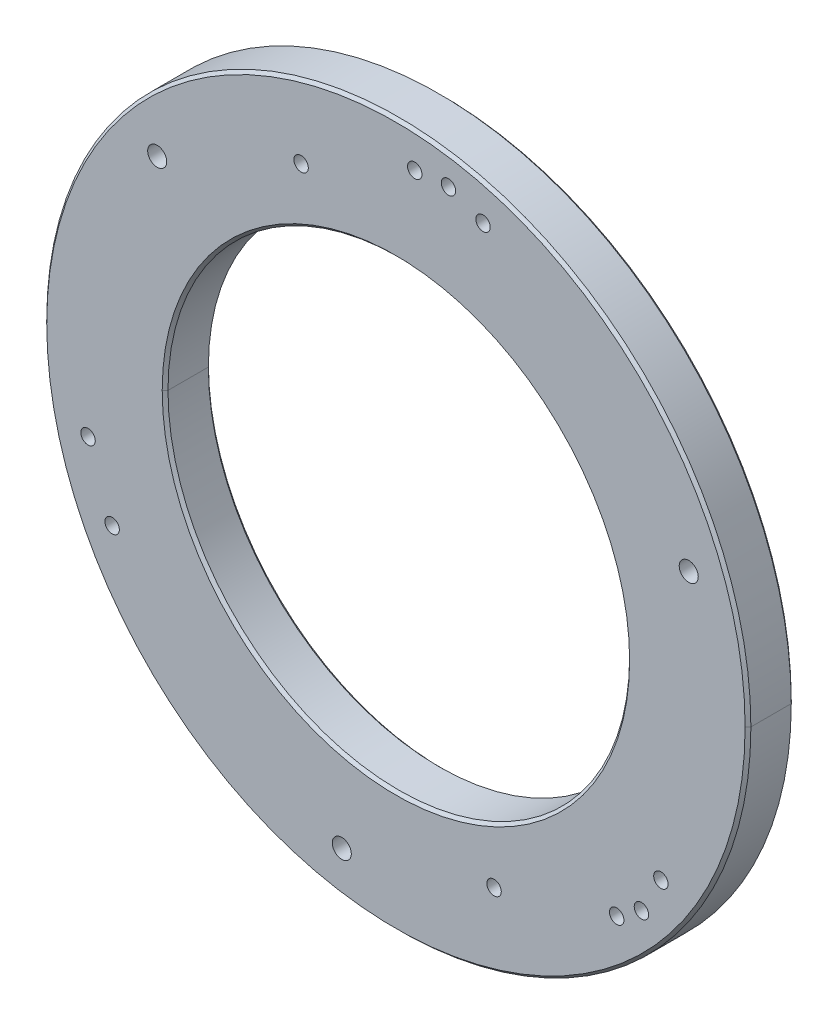
ISO-10303-21;
HEADER;
FILE_DESCRIPTION(('STEP AP214'),'2;1');
FILE_NAME('part.step','',(''),(''),'','','');
FILE_SCHEMA(('AUTOMOTIVE_DESIGN { 1 0 10303 214 1 1 1 1 }'));
ENDSEC;
DATA;
#1=APPLICATION_CONTEXT('core data for automotive mechanical design processes');
#2=APPLICATION_PROTOCOL_DEFINITION('international standard','automotive_design',2000,#1);
#3=PRODUCT_CONTEXT('',#1,'mechanical');
#4=PRODUCT('Part','Part','',(#3));
#5=PRODUCT_RELATED_PRODUCT_CATEGORY('part','',(#4));
#6=PRODUCT_DEFINITION_FORMATION('','',#4);
#7=PRODUCT_DEFINITION_CONTEXT('part definition',#1,'design');
#8=PRODUCT_DEFINITION('design','',#6,#7);
#9=PRODUCT_DEFINITION_SHAPE('','',#8);
#10=(LENGTH_UNIT() NAMED_UNIT(*) SI_UNIT(.MILLI.,.METRE.));
#11=(NAMED_UNIT(*) PLANE_ANGLE_UNIT() SI_UNIT($,.RADIAN.));
#12=(NAMED_UNIT(*) SI_UNIT($,.STERADIAN.) SOLID_ANGLE_UNIT());
#13=UNCERTAINTY_MEASURE_WITH_UNIT(LENGTH_MEASURE(1.E-05),#10,'distance_accuracy_value','');
#14=(GEOMETRIC_REPRESENTATION_CONTEXT(3) GLOBAL_UNCERTAINTY_ASSIGNED_CONTEXT((#13)) GLOBAL_UNIT_ASSIGNED_CONTEXT((#10,
#11,#12)) REPRESENTATION_CONTEXT('',''));
#15=CARTESIAN_POINT('',(0.,0.,0.));
#16=DIRECTION('',(0.,0.,1.));
#17=DIRECTION('',(1.,0.,0.));
#18=AXIS2_PLACEMENT_3D('',#15,#16,#17);
#19=CARTESIAN_POINT('',(-82.5144971077506,-16.0135159189414,0.));
#20=DIRECTION('',(0.,0.,1.));
#21=DIRECTION('',(1.,0.,0.));
#22=AXIS2_PLACEMENT_3D('',#19,#20,#21);
#23=PLANE('',#22);
#24=CARTESIAN_POINT('',(-82.5144971077506,-16.0135159189414,0.));
#25=DIRECTION('',(0.,0.,1.));
#26=DIRECTION('',(1.,0.,0.));
#27=AXIS2_PLACEMENT_3D('',#24,#25,#26);
#28=CIRCLE('',#27,40.5);
#29=CARTESIAN_POINT('',(-123.014497107751,-16.0135159189414,0.));
#30=VERTEX_POINT('',#29);
#31=CARTESIAN_POINT('',(-42.0144971077506,-16.0135159189414,0.));
#32=VERTEX_POINT('',#31);
#33=EDGE_CURVE('E212',#30,#32,#28,.T.);
#34=ORIENTED_EDGE('',*,*,#33,.T.);
#35=CARTESIAN_POINT('',(-82.5144971077506,-16.0135159189414,0.));
#36=DIRECTION('',(0.,0.,1.));
#37=DIRECTION('',(1.,0.,0.));
#38=AXIS2_PLACEMENT_3D('',#35,#36,#37);
#39=CIRCLE('',#38,40.5);
#40=EDGE_CURVE('E214',#32,#30,#39,.T.);
#41=ORIENTED_EDGE('',*,*,#40,.T.);
#42=EDGE_LOOP('',(#34,#41));
#43=FACE_BOUND('',#42,.T.);
#44=CARTESIAN_POINT('',(-82.5144971077506,-16.0135159189414,0.));
#45=DIRECTION('',(0.,0.,1.));
#46=DIRECTION('',(1.,0.,0.));
#47=AXIS2_PLACEMENT_3D('',#44,#45,#46);
#48=CIRCLE('',#47,60.5115996052059);
#49=CARTESIAN_POINT('',(-143.026096712956,-16.0135159189414,0.));
#50=VERTEX_POINT('',#49);
#51=CARTESIAN_POINT('',(-22.0028975025447,-16.0135159189414,0.));
#52=VERTEX_POINT('',#51);
#53=EDGE_CURVE('E196',#50,#52,#48,.F.);
#54=ORIENTED_EDGE('',*,*,#53,.T.);
#55=CARTESIAN_POINT('',(-82.5144971077506,-16.0135159189414,0.));
#56=DIRECTION('',(0.,0.,1.));
#57=DIRECTION('',(1.,0.,0.));
#58=AXIS2_PLACEMENT_3D('',#55,#56,#57);
#59=CIRCLE('',#58,60.5115996052059);
#60=EDGE_CURVE('E209',#52,#50,#59,.F.);
#61=ORIENTED_EDGE('',*,*,#60,.T.);
#62=EDGE_LOOP('',(#54,#61));
#63=FACE_BOUND('',#62,.T.);
#64=CARTESIAN_POINT('',(-91.8951761523299,-69.183415120825,0.));
#65=DIRECTION('',(0.,0.,1.));
#66=DIRECTION('',(1.,0.,0.));
#67=AXIS2_PLACEMENT_3D('',#64,#65,#66);
#68=CIRCLE('',#67,1.65);
#69=CARTESIAN_POINT('',(-90.2451761523299,-69.183415120825,0.));
#70=VERTEX_POINT('',#69);
#71=EDGE_CURVE('E381',#70,#70,#68,.T.);
#72=ORIENTED_EDGE('',*,*,#71,.T.);
#73=EDGE_LOOP('',(#72));
#74=FACE_BOUND('',#73,.T.);
#75=CARTESIAN_POINT('',(-31.7708338197858,2.44344707650623,0.));
#76=DIRECTION('',(0.,0.,1.));
#77=DIRECTION('',(1.,0.,0.));
#78=AXIS2_PLACEMENT_3D('',#75,#76,#77);
#79=CIRCLE('',#78,1.65);
#80=CARTESIAN_POINT('',(-30.1208338197859,2.44344707650623,0.));
#81=VERTEX_POINT('',#80);
#82=EDGE_CURVE('E377',#81,#81,#79,.T.);
#83=ORIENTED_EDGE('',*,*,#82,.T.);
#84=EDGE_LOOP('',(#83));
#85=FACE_BOUND('',#84,.T.);
#86=CARTESIAN_POINT('',(-123.882402822117,18.6871929611194,0.));
#87=DIRECTION('',(0.,0.,1.));
#88=DIRECTION('',(1.,0.,0.));
#89=AXIS2_PLACEMENT_3D('',#86,#87,#88);
#90=CIRCLE('',#89,1.65);
#91=CARTESIAN_POINT('',(-122.232402822117,18.6871929611194,0.));
#92=VERTEX_POINT('',#91);
#93=EDGE_CURVE('E373',#92,#92,#90,.T.);
#94=ORIENTED_EDGE('',*,*,#93,.T.);
#95=EDGE_LOOP('',(#94));
#96=FACE_BOUND('',#95,.T.);
#97=CARTESIAN_POINT('',(-73.4081664605467,39.3227641236998,0.));
#98=DIRECTION('',(0.,0.,1.));
#99=DIRECTION('',(1.,0.,0.));
#100=AXIS2_PLACEMENT_3D('',#97,#98,#99);
#101=CIRCLE('',#100,1.25);
#102=CARTESIAN_POINT('',(-72.1581664605467,39.3227641236998,0.));
#103=VERTEX_POINT('',#102);
#104=EDGE_CURVE('E369',#103,#103,#101,.T.);
#105=ORIENTED_EDGE('',*,*,#104,.T.);
#106=EDGE_LOOP('',(#105));
#107=FACE_BOUND('',#106,.T.);
#108=CARTESIAN_POINT('',(-98.9450242431344,30.0303199031574,0.));
#109=DIRECTION('',(0.,0.,1.));
#110=DIRECTION('',(1.,0.,0.));
#111=AXIS2_PLACEMENT_3D('',#108,#109,#110);
#112=CIRCLE('',#111,1.25);
#113=CARTESIAN_POINT('',(-97.6950242431344,30.0303199031574,0.));
#114=VERTEX_POINT('',#113);
#115=EDGE_CURVE('E365',#114,#114,#112,.T.);
#116=ORIENTED_EDGE('',*,*,#115,.T.);
#117=EDGE_LOOP('',(#116));
#118=FACE_BOUND('',#117,.T.);
#119=CARTESIAN_POINT('',(-39.9697288865487,-52.5704562748082,0.));
#120=DIRECTION('',(0.,0.,1.));
#121=DIRECTION('',(1.,0.,0.));
#122=AXIS2_PLACEMENT_3D('',#119,#120,#121);
#123=CIRCLE('',#122,1.25);
#124=CARTESIAN_POINT('',(-38.7197288865487,-52.5704562748082,0.));
#125=VERTEX_POINT('',#124);
#126=EDGE_CURVE('E361',#125,#125,#123,.T.);
#127=ORIENTED_EDGE('',*,*,#126,.T.);
#128=EDGE_LOOP('',(#127));
#129=FACE_BOUND('',#128,.T.);
#130=CARTESIAN_POINT('',(-65.5065866691364,-61.8629004953506,0.));
#131=DIRECTION('',(0.,0.,1.));
#132=DIRECTION('',(1.,0.,0.));
#133=AXIS2_PLACEMENT_3D('',#130,#131,#132);
#134=CIRCLE('',#133,1.25);
#135=CARTESIAN_POINT('',(-64.2565866691364,-61.8629004953506,0.));
#136=VERTEX_POINT('',#135);
#137=EDGE_CURVE('E357',#136,#136,#134,.T.);
#138=ORIENTED_EDGE('',*,*,#137,.T.);
#139=EDGE_LOOP('',(#138));
#140=FACE_BOUND('',#139,.T.);
#141=CARTESIAN_POINT('',(-36.5984199134899,-46.2908565032668,0.));
#142=DIRECTION('',(0.,0.,-1.));
#143=DIRECTION('',(-1.,0.,0.));
#144=AXIS2_PLACEMENT_3D('',#141,#142,#143);
#145=CIRCLE('',#144,1.25);
#146=CARTESIAN_POINT('',(-37.8484199134899,-46.2908565032668,0.));
#147=VERTEX_POINT('',#146);
#148=EDGE_CURVE('E352',#147,#147,#145,.T.);
#149=ORIENTED_EDGE('',*,*,#148,.F.);
#150=EDGE_LOOP('',(#149));
#151=FACE_BOUND('',#150,.T.);
#152=CARTESIAN_POINT('',(-131.69348180994,-40.6393349191355,0.));
#153=DIRECTION('',(0.,0.,-1.));
#154=DIRECTION('',(-1.,0.,0.));
#155=AXIS2_PLACEMENT_3D('',#152,#153,#154);
#156=CIRCLE('',#155,1.25);
#157=CARTESIAN_POINT('',(-132.94348180994,-40.6393349191355,0.));
#158=VERTEX_POINT('',#157);
#159=EDGE_CURVE('E318',#158,#158,#156,.T.);
#160=ORIENTED_EDGE('',*,*,#159,.F.);
#161=EDGE_LOOP('',(#160));
#162=FACE_BOUND('',#161,.T.);
#163=CARTESIAN_POINT('',(-79.251589599821,38.8896436655783,0.));
#164=DIRECTION('',(0.,0.,-1.));
#165=DIRECTION('',(-1.,0.,0.));
#166=AXIS2_PLACEMENT_3D('',#163,#164,#165);
#167=CIRCLE('',#166,1.25);
#168=CARTESIAN_POINT('',(-80.501589599821,38.8896436655783,0.));
#169=VERTEX_POINT('',#168);
#170=EDGE_CURVE('E327',#169,#169,#167,.T.);
#171=ORIENTED_EDGE('',*,*,#170,.F.);
#172=EDGE_LOOP('',(#171));
#173=FACE_BOUND('',#172,.T.);
#174=CARTESIAN_POINT('',(-67.4218802964211,36.875201361353,0.));
#175=DIRECTION('',(0.,0.,-1.));
#176=DIRECTION('',(-1.,0.,0.));
#177=AXIS2_PLACEMENT_3D('',#174,#175,#176);
#178=CIRCLE('',#177,1.25);
#179=CARTESIAN_POINT('',(-68.6718802964211,36.875201361353,0.));
#180=VERTEX_POINT('',#179);
#181=EDGE_CURVE('E330',#180,#180,#178,.T.);
#182=ORIENTED_EDGE('',*,*,#181,.F.);
#183=EDGE_LOOP('',(#182));
#184=FACE_BOUND('',#183,.T.);
#185=CARTESIAN_POINT('',(-132.330492623555,-34.1407410308416,0.));
#186=DIRECTION('',(0.,0.,1.));
#187=DIRECTION('',(1.,0.,0.));
#188=AXIS2_PLACEMENT_3D('',#185,#186,#187);
#189=CIRCLE('',#188,1.725);
#190=CARTESIAN_POINT('',(-134.055492623555,-34.1407410308416,0.));
#191=VERTEX_POINT('',#190);
#192=CARTESIAN_POINT('',(-130.605492623555,-34.1407410308416,0.));
#193=VERTEX_POINT('',#192);
#194=EDGE_CURVE('E177',#191,#193,#189,.T.);
#195=ORIENTED_EDGE('',*,*,#194,.T.);
#196=CARTESIAN_POINT('',(-132.330492623555,-34.1407410308416,0.));
#197=DIRECTION('',(0.,0.,1.));
#198=DIRECTION('',(1.,0.,0.));
#199=AXIS2_PLACEMENT_3D('',#196,#197,#198);
#200=CIRCLE('',#199,1.725);
#201=EDGE_CURVE('E170',#193,#191,#200,.T.);
#202=ORIENTED_EDGE('',*,*,#201,.T.);
#203=EDGE_LOOP('',(#195,#202));
#204=FACE_BOUND('',#203,.T.);
#205=CARTESIAN_POINT('',(-55.4662346629097,29.5783824644684,0.));
#206=DIRECTION('',(0.,0.,1.));
#207=DIRECTION('',(1.,0.,0.));
#208=AXIS2_PLACEMENT_3D('',#205,#206,#207);
#209=CIRCLE('',#208,1.725);
#210=CARTESIAN_POINT('',(-57.1912346629097,29.5783824644684,0.));
#211=VERTEX_POINT('',#210);
#212=CARTESIAN_POINT('',(-53.7412346629097,29.5783824644684,0.));
#213=VERTEX_POINT('',#212);
#214=EDGE_CURVE('E159',#211,#213,#209,.T.);
#215=ORIENTED_EDGE('',*,*,#214,.T.);
#216=CARTESIAN_POINT('',(-55.4662346629097,29.5783824644684,0.));
#217=DIRECTION('',(0.,0.,1.));
#218=DIRECTION('',(1.,0.,0.));
#219=AXIS2_PLACEMENT_3D('',#216,#217,#218);
#220=CIRCLE('',#219,1.725);
#221=EDGE_CURVE('E168',#213,#211,#220,.T.);
#222=ORIENTED_EDGE('',*,*,#221,.T.);
#223=EDGE_LOOP('',(#215,#222));
#224=FACE_BOUND('',#223,.T.);
#225=CARTESIAN_POINT('',(-32.4911022931427,-33.5603011148116,0.));
#226=DIRECTION('',(0.,0.,1.));
#227=DIRECTION('',(1.,0.,0.));
#228=AXIS2_PLACEMENT_3D('',#225,#226,#227);
#229=CIRCLE('',#228,1.725);
#230=CARTESIAN_POINT('',(-34.2161022931427,-33.5603011148116,0.));
#231=VERTEX_POINT('',#230);
#232=CARTESIAN_POINT('',(-30.7661022931426,-33.5603011148116,0.));
#233=VERTEX_POINT('',#232);
#234=EDGE_CURVE('E151',#231,#233,#229,.T.);
#235=ORIENTED_EDGE('',*,*,#234,.T.);
#236=CARTESIAN_POINT('',(-32.4911022931427,-33.5603011148116,0.));
#237=DIRECTION('',(0.,0.,1.));
#238=DIRECTION('',(1.,0.,0.));
#239=AXIS2_PLACEMENT_3D('',#236,#237,#238);
#240=CIRCLE('',#239,1.725);
#241=EDGE_CURVE('E171',#233,#231,#240,.T.);
#242=ORIENTED_EDGE('',*,*,#241,.T.);
#243=EDGE_LOOP('',(#235,#242));
#244=FACE_BOUND('',#243,.T.);
#245=CARTESIAN_POINT('',(-135.863778251723,-29.3872849908934,0.));
#246=DIRECTION('',(0.,0.,-1.));
#247=DIRECTION('',(-1.,0.,0.));
#248=AXIS2_PLACEMENT_3D('',#245,#246,#247);
#249=CIRCLE('',#248,1.25);
#250=CARTESIAN_POINT('',(-137.113778251723,-29.3872849908934,0.));
#251=VERTEX_POINT('',#250);
#252=EDGE_CURVE('E317',#251,#251,#249,.T.);
#253=ORIENTED_EDGE('',*,*,#252,.F.);
#254=EDGE_LOOP('',(#253));
#255=FACE_BOUND('',#254,.T.);
#256=CARTESIAN_POINT('',(-44.257832775107,-55.5284641272837,0.));
#257=DIRECTION('',(0.,0.,-1.));
#258=DIRECTION('',(-1.,0.,0.));
#259=AXIS2_PLACEMENT_3D('',#256,#257,#258);
#260=CIRCLE('',#259,1.25);
#261=CARTESIAN_POINT('',(-45.507832775107,-55.5284641272837,0.));
#262=VERTEX_POINT('',#261);
#263=EDGE_CURVE('E349',#262,#262,#260,.T.);
#264=ORIENTED_EDGE('',*,*,#263,.F.);
#265=EDGE_LOOP('',(#264));
#266=FACE_BOUND('',#265,.T.);
#267=ADVANCED_FACE('F17',(#43,#63,#74,#85,#96,#107,#118,#129,#140,#151,#162,#173,#184,#204,#224,
#244,#255,#266),#23,.F.);
#268=CARTESIAN_POINT('',(-82.5144971077506,-16.0135159189414,8.));
#269=DIRECTION('',(0.,0.,1.));
#270=DIRECTION('',(1.,0.,0.));
#271=AXIS2_PLACEMENT_3D('',#268,#269,#270);
#272=PLANE('',#271);
#273=CARTESIAN_POINT('',(-82.5144971077506,-16.0135159189414,8.));
#274=DIRECTION('',(0.,0.,1.));
#275=DIRECTION('',(1.,0.,0.));
#276=AXIS2_PLACEMENT_3D('',#273,#274,#275);
#277=CIRCLE('',#276,40.5);
#278=CARTESIAN_POINT('',(-123.014497107751,-16.0135159189414,8.));
#279=VERTEX_POINT('',#278);
#280=CARTESIAN_POINT('',(-42.0144971077506,-16.0135159189414,8.));
#281=VERTEX_POINT('',#280);
#282=EDGE_CURVE('E232',#279,#281,#277,.F.);
#283=ORIENTED_EDGE('',*,*,#282,.T.);
#284=CARTESIAN_POINT('',(-82.5144971077506,-16.0135159189414,8.));
#285=DIRECTION('',(0.,0.,1.));
#286=DIRECTION('',(1.,0.,0.));
#287=AXIS2_PLACEMENT_3D('',#284,#285,#286);
#288=CIRCLE('',#287,40.5);
#289=EDGE_CURVE('E234',#281,#279,#288,.F.);
#290=ORIENTED_EDGE('',*,*,#289,.T.);
#291=EDGE_LOOP('',(#283,#290));
#292=FACE_BOUND('',#291,.T.);
#293=CARTESIAN_POINT('',(-82.5144971077506,-16.0135159189414,8.));
#294=DIRECTION('',(0.,0.,1.));
#295=DIRECTION('',(1.,0.,0.));
#296=AXIS2_PLACEMENT_3D('',#293,#294,#295);
#297=CIRCLE('',#296,60.5115996052059);
#298=CARTESIAN_POINT('',(-22.0028975025447,-16.0135159189414,8.));
#299=VERTEX_POINT('',#298);
#300=CARTESIAN_POINT('',(-143.026096712956,-16.0135159189414,8.));
#301=VERTEX_POINT('',#300);
#302=EDGE_CURVE('E227',#299,#301,#297,.T.);
#303=ORIENTED_EDGE('',*,*,#302,.T.);
#304=CARTESIAN_POINT('',(-82.5144971077506,-16.0135159189414,8.));
#305=DIRECTION('',(0.,0.,1.));
#306=DIRECTION('',(1.,0.,0.));
#307=AXIS2_PLACEMENT_3D('',#304,#305,#306);
#308=CIRCLE('',#307,60.5115996052059);
#309=EDGE_CURVE('E229',#301,#299,#308,.T.);
#310=ORIENTED_EDGE('',*,*,#309,.T.);
#311=EDGE_LOOP('',(#303,#310));
#312=FACE_BOUND('',#311,.T.);
#313=CARTESIAN_POINT('',(-91.8951761523299,-69.183415120825,8.));
#314=DIRECTION('',(0.,0.,1.));
#315=DIRECTION('',(1.,0.,0.));
#316=AXIS2_PLACEMENT_3D('',#313,#314,#315);
#317=CIRCLE('',#316,1.65);
#318=CARTESIAN_POINT('',(-90.2451761523299,-69.183415120825,8.));
#319=VERTEX_POINT('',#318);
#320=EDGE_CURVE('E249',#319,#319,#317,.T.);
#321=ORIENTED_EDGE('',*,*,#320,.F.);
#322=EDGE_LOOP('',(#321));
#323=FACE_BOUND('',#322,.T.);
#324=CARTESIAN_POINT('',(-31.7708338197858,2.44344707650623,8.));
#325=DIRECTION('',(0.,0.,1.));
#326=DIRECTION('',(1.,0.,0.));
#327=AXIS2_PLACEMENT_3D('',#324,#325,#326);
#328=CIRCLE('',#327,1.65);
#329=CARTESIAN_POINT('',(-30.1208338197859,2.44344707650623,8.));
#330=VERTEX_POINT('',#329);
#331=EDGE_CURVE('E273',#330,#330,#328,.T.);
#332=ORIENTED_EDGE('',*,*,#331,.F.);
#333=EDGE_LOOP('',(#332));
#334=FACE_BOUND('',#333,.T.);
#335=CARTESIAN_POINT('',(-123.882402822117,18.6871929611194,8.));
#336=DIRECTION('',(0.,0.,1.));
#337=DIRECTION('',(1.,0.,0.));
#338=AXIS2_PLACEMENT_3D('',#335,#336,#337);
#339=CIRCLE('',#338,1.65);
#340=CARTESIAN_POINT('',(-122.232402822117,18.6871929611194,8.));
#341=VERTEX_POINT('',#340);
#342=EDGE_CURVE('E277',#341,#341,#339,.T.);
#343=ORIENTED_EDGE('',*,*,#342,.F.);
#344=EDGE_LOOP('',(#343));
#345=FACE_BOUND('',#344,.T.);
#346=CARTESIAN_POINT('',(-73.4081664605467,39.3227641236998,8.));
#347=DIRECTION('',(0.,0.,1.));
#348=DIRECTION('',(1.,0.,0.));
#349=AXIS2_PLACEMENT_3D('',#346,#347,#348);
#350=CIRCLE('',#349,1.25);
#351=CARTESIAN_POINT('',(-72.1581664605467,39.3227641236998,8.));
#352=VERTEX_POINT('',#351);
#353=EDGE_CURVE('E281',#352,#352,#350,.T.);
#354=ORIENTED_EDGE('',*,*,#353,.F.);
#355=EDGE_LOOP('',(#354));
#356=FACE_BOUND('',#355,.T.);
#357=CARTESIAN_POINT('',(-98.9450242431344,30.0303199031574,8.));
#358=DIRECTION('',(0.,0.,1.));
#359=DIRECTION('',(1.,0.,0.));
#360=AXIS2_PLACEMENT_3D('',#357,#358,#359);
#361=CIRCLE('',#360,1.25);
#362=CARTESIAN_POINT('',(-97.6950242431344,30.0303199031574,8.));
#363=VERTEX_POINT('',#362);
#364=EDGE_CURVE('E285',#363,#363,#361,.T.);
#365=ORIENTED_EDGE('',*,*,#364,.F.);
#366=EDGE_LOOP('',(#365));
#367=FACE_BOUND('',#366,.T.);
#368=CARTESIAN_POINT('',(-39.9697288865487,-52.5704562748082,8.));
#369=DIRECTION('',(0.,0.,1.));
#370=DIRECTION('',(1.,0.,0.));
#371=AXIS2_PLACEMENT_3D('',#368,#369,#370);
#372=CIRCLE('',#371,1.25);
#373=CARTESIAN_POINT('',(-38.7197288865487,-52.5704562748082,8.));
#374=VERTEX_POINT('',#373);
#375=EDGE_CURVE('E289',#374,#374,#372,.T.);
#376=ORIENTED_EDGE('',*,*,#375,.F.);
#377=EDGE_LOOP('',(#376));
#378=FACE_BOUND('',#377,.T.);
#379=CARTESIAN_POINT('',(-65.5065866691364,-61.8629004953506,8.));
#380=DIRECTION('',(0.,0.,1.));
#381=DIRECTION('',(1.,0.,0.));
#382=AXIS2_PLACEMENT_3D('',#379,#380,#381);
#383=CIRCLE('',#382,1.25);
#384=CARTESIAN_POINT('',(-64.2565866691364,-61.8629004953506,8.));
#385=VERTEX_POINT('',#384);
#386=EDGE_CURVE('E293',#385,#385,#383,.T.);
#387=ORIENTED_EDGE('',*,*,#386,.F.);
#388=EDGE_LOOP('',(#387));
#389=FACE_BOUND('',#388,.T.);
#390=CARTESIAN_POINT('',(-36.5984199134899,-46.2908565032668,8.));
#391=DIRECTION('',(0.,0.,-1.));
#392=DIRECTION('',(-1.,0.,0.));
#393=AXIS2_PLACEMENT_3D('',#390,#391,#392);
#394=CIRCLE('',#393,1.25);
#395=CARTESIAN_POINT('',(-37.8484199134899,-46.2908565032668,8.));
#396=VERTEX_POINT('',#395);
#397=EDGE_CURVE('E297',#396,#396,#394,.T.);
#398=ORIENTED_EDGE('',*,*,#397,.T.);
#399=EDGE_LOOP('',(#398));
#400=FACE_BOUND('',#399,.T.);
#401=CARTESIAN_POINT('',(-44.257832775107,-55.5284641272837,8.));
#402=DIRECTION('',(0.,0.,-1.));
#403=DIRECTION('',(-1.,0.,0.));
#404=AXIS2_PLACEMENT_3D('',#401,#402,#403);
#405=CIRCLE('',#404,1.25);
#406=CARTESIAN_POINT('',(-45.507832775107,-55.5284641272837,8.));
#407=VERTEX_POINT('',#406);
#408=EDGE_CURVE('E301',#407,#407,#405,.T.);
#409=ORIENTED_EDGE('',*,*,#408,.T.);
#410=EDGE_LOOP('',(#409));
#411=FACE_BOUND('',#410,.T.);
#412=CARTESIAN_POINT('',(-135.863778251723,-29.3872849908934,8.));
#413=DIRECTION('',(0.,0.,-1.));
#414=DIRECTION('',(-1.,0.,0.));
#415=AXIS2_PLACEMENT_3D('',#412,#413,#414);
#416=CIRCLE('',#415,1.25);
#417=CARTESIAN_POINT('',(-137.113778251723,-29.3872849908934,8.));
#418=VERTEX_POINT('',#417);
#419=EDGE_CURVE('E305',#418,#418,#416,.T.);
#420=ORIENTED_EDGE('',*,*,#419,.T.);
#421=EDGE_LOOP('',(#420));
#422=FACE_BOUND('',#421,.T.);
#423=CARTESIAN_POINT('',(-79.251589599821,38.8896436655783,8.));
#424=DIRECTION('',(0.,0.,-1.));
#425=DIRECTION('',(-1.,0.,0.));
#426=AXIS2_PLACEMENT_3D('',#423,#424,#425);
#427=CIRCLE('',#426,1.25);
#428=CARTESIAN_POINT('',(-80.501589599821,38.8896436655783,8.));
#429=VERTEX_POINT('',#428);
#430=EDGE_CURVE('E309',#429,#429,#427,.T.);
#431=ORIENTED_EDGE('',*,*,#430,.T.);
#432=EDGE_LOOP('',(#431));
#433=FACE_BOUND('',#432,.T.);
#434=CARTESIAN_POINT('',(-67.4218802964211,36.875201361353,8.));
#435=DIRECTION('',(0.,0.,-1.));
#436=DIRECTION('',(-1.,0.,0.));
#437=AXIS2_PLACEMENT_3D('',#434,#435,#436);
#438=CIRCLE('',#437,1.25);
#439=CARTESIAN_POINT('',(-68.6718802964211,36.875201361353,8.));
#440=VERTEX_POINT('',#439);
#441=EDGE_CURVE('E166',#440,#440,#438,.T.);
#442=ORIENTED_EDGE('',*,*,#441,.T.);
#443=EDGE_LOOP('',(#442));
#444=FACE_BOUND('',#443,.T.);
#445=CARTESIAN_POINT('',(-131.69348180994,-40.6393349191355,8.));
#446=DIRECTION('',(0.,0.,-1.));
#447=DIRECTION('',(-1.,0.,0.));
#448=AXIS2_PLACEMENT_3D('',#445,#446,#447);
#449=CIRCLE('',#448,1.25);
#450=CARTESIAN_POINT('',(-132.94348180994,-40.6393349191355,8.));
#451=VERTEX_POINT('',#450);
#452=EDGE_CURVE('E315',#451,#451,#449,.T.);
#453=ORIENTED_EDGE('',*,*,#452,.T.);
#454=EDGE_LOOP('',(#453));
#455=FACE_BOUND('',#454,.T.);
#456=ADVANCED_FACE('F262',(#292,#312,#323,#334,#345,#356,#367,#378,#389,#400,#411,#422,#433,
#444,#455),#272,.T.);
#457=CARTESIAN_POINT('',(-32.4911022931427,-33.5603011148116,0.0250000000000042));
#458=DIRECTION('',(0.,0.,-1.));
#459=DIRECTION('',(-1.,0.,0.));
#460=AXIS2_PLACEMENT_3D('',#457,#458,#459);
#461=CONICAL_SURFACE('',#460,1.7,0.785398163397448);
#462=DIRECTION('',(0.707106781186548,0.,-0.707106781186548));
#463=VECTOR('',#462,1.);
#464=CARTESIAN_POINT('',(-30.7911022931427,-33.5603011148116,0.0250000000000042));
#465=LINE('',#464,#463);
#466=CARTESIAN_POINT('',(-30.7911022931427,-33.5603011148116,0.0250000000000042));
#467=VERTEX_POINT('',#466);
#468=EDGE_CURVE('E162',#467,#233,#465,.T.);
#469=ORIENTED_EDGE('',*,*,#468,.F.);
#470=ORIENTED_EDGE('',*,*,#468,.T.);
#471=ORIENTED_EDGE('',*,*,#234,.F.);
#472=DIRECTION('',(-0.707106781186548,0.,-0.707106781186548));
#473=VECTOR('',#472,1.);
#474=CARTESIAN_POINT('',(-34.1911022931426,-33.5603011148116,0.0250000000000042));
#475=LINE('',#474,#473);
#476=CARTESIAN_POINT('',(-34.1911022931426,-33.5603011148116,0.0250000000000042));
#477=VERTEX_POINT('',#476);
#478=EDGE_CURVE('E146',#477,#231,#475,.T.);
#479=ORIENTED_EDGE('',*,*,#478,.F.);
#480=ORIENTED_EDGE('',*,*,#478,.T.);
#481=ORIENTED_EDGE('',*,*,#241,.F.);
#482=EDGE_LOOP('',(#469,#470,#471,#479,#480,#481));
#483=FACE_BOUND('',#482,.T.);
#484=CARTESIAN_POINT('',(-32.4911022931427,-33.5603011148116,1.725));
#485=VERTEX_POINT('',#484);
#486=VERTEX_LOOP('',#485);
#487=FACE_BOUND('',#486,.T.);
#488=ADVANCED_FACE('F147',(#483,#487),#461,.F.);
#489=CARTESIAN_POINT('',(-82.5144971077506,-16.0135159189414,0.));
#490=DIRECTION('',(0.,0.,1.));
#491=DIRECTION('',(1.,0.,0.));
#492=AXIS2_PLACEMENT_3D('',#489,#490,#491);
#493=CYLINDRICAL_SURFACE('',#492,40.);
#494=DIRECTION('',(0.,0.,1.));
#495=VECTOR('',#494,1.);
#496=CARTESIAN_POINT('',(-122.514497107751,-16.0135159189414,0.));
#497=LINE('',#496,#495);
#498=CARTESIAN_POINT('',(-122.514497107751,-16.0135159189414,0.49999999999998));
#499=VERTEX_POINT('',#498);
#500=CARTESIAN_POINT('',(-122.514497107751,-16.0135159189414,7.5));
#501=VERTEX_POINT('',#500);
#502=EDGE_CURVE('E176',#499,#501,#497,.T.);
#503=ORIENTED_EDGE('',*,*,#502,.F.);
#504=CARTESIAN_POINT('',(-82.5144971077506,-16.0135159189414,0.49999999999998));
#505=DIRECTION('',(0.,0.,1.));
#506=DIRECTION('',(1.,0.,0.));
#507=AXIS2_PLACEMENT_3D('',#504,#505,#506);
#508=CIRCLE('',#507,40.);
#509=CARTESIAN_POINT('',(-42.5144971077506,-16.0135159189414,0.49999999999998));
#510=VERTEX_POINT('',#509);
#511=EDGE_CURVE('E219',#499,#510,#508,.F.);
#512=ORIENTED_EDGE('',*,*,#511,.T.);
#513=DIRECTION('',(0.,0.,1.));
#514=VECTOR('',#513,1.);
#515=CARTESIAN_POINT('',(-42.5144971077506,-16.0135159189414,0.));
#516=LINE('',#515,#514);
#517=CARTESIAN_POINT('',(-42.5144971077506,-16.0135159189414,7.5));
#518=VERTEX_POINT('',#517);
#519=EDGE_CURVE('E202',#510,#518,#516,.T.);
#520=ORIENTED_EDGE('',*,*,#519,.T.);
#521=CARTESIAN_POINT('',(-82.5144971077506,-16.0135159189414,7.5));
#522=DIRECTION('',(0.,0.,1.));
#523=DIRECTION('',(1.,0.,0.));
#524=AXIS2_PLACEMENT_3D('',#521,#522,#523);
#525=CIRCLE('',#524,40.);
#526=EDGE_CURVE('E217',#518,#501,#525,.T.);
#527=ORIENTED_EDGE('',*,*,#526,.T.);
#528=EDGE_LOOP('',(#503,#512,#520,#527));
#529=FACE_BOUND('',#528,.T.);
#530=ADVANCED_FACE('F456',(#529),#493,.F.);
#531=CARTESIAN_POINT('',(-82.5144971077506,-16.0135159189414,8.));
#532=DIRECTION('',(0.,0.,-1.));
#533=DIRECTION('',(-1.,0.,0.));
#534=AXIS2_PLACEMENT_3D('',#531,#532,#533);
#535=CYLINDRICAL_SURFACE('',#534,61.0115996052059);
#536=DIRECTION('',(0.,0.,-1.));
#537=VECTOR('',#536,1.);
#538=CARTESIAN_POINT('',(-143.526096712956,-16.0135159189414,8.));
#539=LINE('',#538,#537);
#540=CARTESIAN_POINT('',(-143.526096712956,-16.0135159189414,7.5));
#541=VERTEX_POINT('',#540);
#542=CARTESIAN_POINT('',(-143.526096712956,-16.0135159189414,0.500000000000007));
#543=VERTEX_POINT('',#542);
#544=EDGE_CURVE('E187',#541,#543,#539,.T.);
#545=ORIENTED_EDGE('',*,*,#544,.T.);
#546=CARTESIAN_POINT('',(-82.5144971077506,-16.0135159189414,0.500000000000007));
#547=DIRECTION('',(0.,0.,1.));
#548=DIRECTION('',(1.,0.,0.));
#549=AXIS2_PLACEMENT_3D('',#546,#547,#548);
#550=CIRCLE('',#549,61.0115996052059);
#551=CARTESIAN_POINT('',(-21.5028975025447,-16.0135159189414,0.500000000000007));
#552=VERTEX_POINT('',#551);
#553=EDGE_CURVE('E240',#543,#552,#550,.T.);
#554=ORIENTED_EDGE('',*,*,#553,.T.);
#555=DIRECTION('',(0.,0.,-1.));
#556=VECTOR('',#555,1.);
#557=CARTESIAN_POINT('',(-21.5028975025447,-16.0135159189414,8.));
#558=LINE('',#557,#556);
#559=CARTESIAN_POINT('',(-21.5028975025447,-16.0135159189414,7.5));
#560=VERTEX_POINT('',#559);
#561=EDGE_CURVE('E200',#560,#552,#558,.T.);
#562=ORIENTED_EDGE('',*,*,#561,.F.);
#563=CARTESIAN_POINT('',(-82.5144971077506,-16.0135159189414,7.5));
#564=DIRECTION('',(0.,0.,1.));
#565=DIRECTION('',(1.,0.,0.));
#566=AXIS2_PLACEMENT_3D('',#563,#564,#565);
#567=CIRCLE('',#566,61.0115996052059);
#568=EDGE_CURVE('E237',#560,#541,#567,.F.);
#569=ORIENTED_EDGE('',*,*,#568,.T.);
#570=EDGE_LOOP('',(#545,#554,#562,#569));
#571=FACE_BOUND('',#570,.T.);
#572=ADVANCED_FACE('F458',(#571),#535,.T.);
#573=CARTESIAN_POINT('',(-82.5144971077506,-16.0135159189414,8.));
#574=DIRECTION('',(0.,0.,-1.));
#575=DIRECTION('',(-1.,0.,0.));
#576=AXIS2_PLACEMENT_3D('',#573,#574,#575);
#577=CYLINDRICAL_SURFACE('',#576,61.0115996052059);
#578=ORIENTED_EDGE('',*,*,#561,.T.);
#579=CARTESIAN_POINT('',(-82.5144971077506,-16.0135159189414,0.500000000000007));
#580=DIRECTION('',(0.,0.,1.));
#581=DIRECTION('',(1.,0.,0.));
#582=AXIS2_PLACEMENT_3D('',#579,#580,#581);
#583=CIRCLE('',#582,61.0115996052059);
#584=EDGE_CURVE('E11',#552,#543,#583,.T.);
#585=ORIENTED_EDGE('',*,*,#584,.T.);
#586=ORIENTED_EDGE('',*,*,#544,.F.);
#587=CARTESIAN_POINT('',(-82.5144971077506,-16.0135159189414,7.5));
#588=DIRECTION('',(0.,0.,1.));
#589=DIRECTION('',(1.,0.,0.));
#590=AXIS2_PLACEMENT_3D('',#587,#588,#589);
#591=CIRCLE('',#590,61.0115996052059);
#592=EDGE_CURVE('E27',#541,#560,#591,.F.);
#593=ORIENTED_EDGE('',*,*,#592,.T.);
#594=EDGE_LOOP('',(#578,#585,#586,#593));
#595=FACE_BOUND('',#594,.T.);
#596=ADVANCED_FACE('F461',(#595),#577,.T.);
#597=CARTESIAN_POINT('',(-82.5144971077506,-16.0135159189414,0.));
#598=DIRECTION('',(0.,0.,1.));
#599=DIRECTION('',(1.,0.,0.));
#600=AXIS2_PLACEMENT_3D('',#597,#598,#599);
#601=CYLINDRICAL_SURFACE('',#600,40.);
#602=ORIENTED_EDGE('',*,*,#519,.F.);
#603=CARTESIAN_POINT('',(-82.5144971077506,-16.0135159189414,0.49999999999998));
#604=DIRECTION('',(0.,0.,1.));
#605=DIRECTION('',(1.,0.,0.));
#606=AXIS2_PLACEMENT_3D('',#603,#604,#605);
#607=CIRCLE('',#606,40.);
#608=EDGE_CURVE('E225',#510,#499,#607,.F.);
#609=ORIENTED_EDGE('',*,*,#608,.T.);
#610=ORIENTED_EDGE('',*,*,#502,.T.);
#611=CARTESIAN_POINT('',(-82.5144971077506,-16.0135159189414,7.5));
#612=DIRECTION('',(0.,0.,1.));
#613=DIRECTION('',(1.,0.,0.));
#614=AXIS2_PLACEMENT_3D('',#611,#612,#613);
#615=CIRCLE('',#614,40.);
#616=EDGE_CURVE('E222',#501,#518,#615,.T.);
#617=ORIENTED_EDGE('',*,*,#616,.T.);
#618=EDGE_LOOP('',(#602,#609,#610,#617));
#619=FACE_BOUND('',#618,.T.);
#620=ADVANCED_FACE('F450',(#619),#601,.F.);
#621=CARTESIAN_POINT('',(-132.330492623555,-34.1407410308416,0.0250000000000042));
#622=DIRECTION('',(0.,0.,-1.));
#623=DIRECTION('',(-1.,0.,0.));
#624=AXIS2_PLACEMENT_3D('',#621,#622,#623);
#625=CONICAL_SURFACE('',#624,1.7,0.785398163397726);
#626=DIRECTION('',(-0.707106781186744,0.,-0.707106781186351));
#627=VECTOR('',#626,1.);
#628=CARTESIAN_POINT('',(-134.030492623555,-34.1407410308416,0.0250000000000042));
#629=LINE('',#628,#627);
#630=CARTESIAN_POINT('',(-134.030492623555,-34.1407410308416,0.0250000000000042));
#631=VERTEX_POINT('',#630);
#632=EDGE_CURVE('E172',#631,#191,#629,.T.);
#633=ORIENTED_EDGE('',*,*,#632,.F.);
#634=ORIENTED_EDGE('',*,*,#632,.T.);
#635=ORIENTED_EDGE('',*,*,#201,.F.);
#636=DIRECTION('',(0.707106781186744,0.,-0.707106781186351));
#637=VECTOR('',#636,1.);
#638=CARTESIAN_POINT('',(-130.630492623555,-34.1407410308416,0.0250000000000042));
#639=LINE('',#638,#637);
#640=CARTESIAN_POINT('',(-130.630492623555,-34.1407410308416,0.0250000000000042));
#641=VERTEX_POINT('',#640);
#642=EDGE_CURVE('E180',#641,#193,#639,.T.);
#643=ORIENTED_EDGE('',*,*,#642,.F.);
#644=ORIENTED_EDGE('',*,*,#642,.T.);
#645=ORIENTED_EDGE('',*,*,#194,.F.);
#646=EDGE_LOOP('',(#633,#634,#635,#643,#644,#645));
#647=FACE_BOUND('',#646,.T.);
#648=CARTESIAN_POINT('',(-132.330492623555,-34.1407410308416,1.72499999999906));
#649=VERTEX_POINT('',#648);
#650=VERTEX_LOOP('',#649);
#651=FACE_BOUND('',#650,.T.);
#652=ADVANCED_FACE('F447',(#647,#651),#625,.F.);
#653=CARTESIAN_POINT('',(-55.4662346629097,29.5783824644684,0.0250000000000042));
#654=DIRECTION('',(0.,0.,-1.));
#655=DIRECTION('',(-1.,0.,0.));
#656=AXIS2_PLACEMENT_3D('',#653,#654,#655);
#657=CONICAL_SURFACE('',#656,1.7,0.785398163397448);
#658=DIRECTION('',(-0.707106781186548,0.,-0.707106781186548));
#659=VECTOR('',#658,1.);
#660=CARTESIAN_POINT('',(-57.1662346629097,29.5783824644684,0.0250000000000042));
#661=LINE('',#660,#659);
#662=CARTESIAN_POINT('',(-57.1662346629097,29.5783824644684,0.0250000000000042));
#663=VERTEX_POINT('',#662);
#664=EDGE_CURVE('E184',#663,#211,#661,.T.);
#665=ORIENTED_EDGE('',*,*,#664,.F.);
#666=ORIENTED_EDGE('',*,*,#664,.T.);
#667=ORIENTED_EDGE('',*,*,#221,.F.);
#668=DIRECTION('',(0.707106781186548,0.,-0.707106781186548));
#669=VECTOR('',#668,1.);
#670=CARTESIAN_POINT('',(-53.7662346629097,29.5783824644684,0.0250000000000042));
#671=LINE('',#670,#669);
#672=CARTESIAN_POINT('',(-53.7662346629097,29.5783824644684,0.0250000000000042));
#673=VERTEX_POINT('',#672);
#674=EDGE_CURVE('E153',#673,#213,#671,.T.);
#675=ORIENTED_EDGE('',*,*,#674,.F.);
#676=ORIENTED_EDGE('',*,*,#674,.T.);
#677=ORIENTED_EDGE('',*,*,#214,.F.);
#678=EDGE_LOOP('',(#665,#666,#667,#675,#676,#677));
#679=FACE_BOUND('',#678,.T.);
#680=CARTESIAN_POINT('',(-55.4662346629097,29.5783824644684,1.725));
#681=VERTEX_POINT('',#680);
#682=VERTEX_LOOP('',#681);
#683=FACE_BOUND('',#682,.T.);
#684=ADVANCED_FACE('F445',(#679,#683),#657,.F.);
#685=CARTESIAN_POINT('',(-67.4218802964211,36.875201361353,0.));
#686=DIRECTION('',(0.,0.,-1.));
#687=DIRECTION('',(-1.,0.,0.));
#688=AXIS2_PLACEMENT_3D('',#685,#686,#687);
#689=CYLINDRICAL_SURFACE('',#688,1.25);
#690=ORIENTED_EDGE('',*,*,#441,.F.);
#691=EDGE_LOOP('',(#690));
#692=FACE_BOUND('',#691,.T.);
#693=ORIENTED_EDGE('',*,*,#181,.T.);
#694=EDGE_LOOP('',(#693));
#695=FACE_BOUND('',#694,.T.);
#696=ADVANCED_FACE('F334',(#692,#695),#689,.F.);
#697=CARTESIAN_POINT('',(-79.251589599821,38.8896436655783,0.));
#698=DIRECTION('',(0.,0.,-1.));
#699=DIRECTION('',(-1.,0.,0.));
#700=AXIS2_PLACEMENT_3D('',#697,#698,#699);
#701=CYLINDRICAL_SURFACE('',#700,1.25);
#702=ORIENTED_EDGE('',*,*,#430,.F.);
#703=EDGE_LOOP('',(#702));
#704=FACE_BOUND('',#703,.T.);
#705=ORIENTED_EDGE('',*,*,#170,.T.);
#706=EDGE_LOOP('',(#705));
#707=FACE_BOUND('',#706,.T.);
#708=ADVANCED_FACE('F438',(#704,#707),#701,.F.);
#709=CARTESIAN_POINT('',(-135.863778251723,-29.3872849908934,0.));
#710=DIRECTION('',(0.,0.,-1.));
#711=DIRECTION('',(-1.,0.,0.));
#712=AXIS2_PLACEMENT_3D('',#709,#710,#711);
#713=CYLINDRICAL_SURFACE('',#712,1.25);
#714=ORIENTED_EDGE('',*,*,#419,.F.);
#715=EDGE_LOOP('',(#714));
#716=FACE_BOUND('',#715,.T.);
#717=ORIENTED_EDGE('',*,*,#252,.T.);
#718=EDGE_LOOP('',(#717));
#719=FACE_BOUND('',#718,.T.);
#720=ADVANCED_FACE('F435',(#716,#719),#713,.F.);
#721=CARTESIAN_POINT('',(-131.69348180994,-40.6393349191355,0.));
#722=DIRECTION('',(0.,0.,-1.));
#723=DIRECTION('',(-1.,0.,0.));
#724=AXIS2_PLACEMENT_3D('',#721,#722,#723);
#725=CYLINDRICAL_SURFACE('',#724,1.25);
#726=ORIENTED_EDGE('',*,*,#452,.F.);
#727=EDGE_LOOP('',(#726));
#728=FACE_BOUND('',#727,.T.);
#729=ORIENTED_EDGE('',*,*,#159,.T.);
#730=EDGE_LOOP('',(#729));
#731=FACE_BOUND('',#730,.T.);
#732=ADVANCED_FACE('F431',(#728,#731),#725,.F.);
#733=CARTESIAN_POINT('',(-44.257832775107,-55.5284641272837,0.));
#734=DIRECTION('',(0.,0.,-1.));
#735=DIRECTION('',(-1.,0.,0.));
#736=AXIS2_PLACEMENT_3D('',#733,#734,#735);
#737=CYLINDRICAL_SURFACE('',#736,1.25);
#738=ORIENTED_EDGE('',*,*,#408,.F.);
#739=EDGE_LOOP('',(#738));
#740=FACE_BOUND('',#739,.T.);
#741=ORIENTED_EDGE('',*,*,#263,.T.);
#742=EDGE_LOOP('',(#741));
#743=FACE_BOUND('',#742,.T.);
#744=ADVANCED_FACE('F427',(#740,#743),#737,.F.);
#745=CARTESIAN_POINT('',(-36.5984199134899,-46.2908565032668,0.));
#746=DIRECTION('',(0.,0.,-1.));
#747=DIRECTION('',(-1.,0.,0.));
#748=AXIS2_PLACEMENT_3D('',#745,#746,#747);
#749=CYLINDRICAL_SURFACE('',#748,1.25);
#750=ORIENTED_EDGE('',*,*,#397,.F.);
#751=EDGE_LOOP('',(#750));
#752=FACE_BOUND('',#751,.T.);
#753=ORIENTED_EDGE('',*,*,#148,.T.);
#754=EDGE_LOOP('',(#753));
#755=FACE_BOUND('',#754,.T.);
#756=ADVANCED_FACE('F423',(#752,#755),#749,.F.);
#757=CARTESIAN_POINT('',(-65.5065866691364,-61.8629004953506,8.));
#758=DIRECTION('',(0.,0.,1.));
#759=DIRECTION('',(1.,0.,0.));
#760=AXIS2_PLACEMENT_3D('',#757,#758,#759);
#761=CYLINDRICAL_SURFACE('',#760,1.25);
#762=ORIENTED_EDGE('',*,*,#137,.F.);
#763=EDGE_LOOP('',(#762));
#764=FACE_BOUND('',#763,.T.);
#765=ORIENTED_EDGE('',*,*,#386,.T.);
#766=EDGE_LOOP('',(#765));
#767=FACE_BOUND('',#766,.T.);
#768=ADVANCED_FACE('F419',(#764,#767),#761,.F.);
#769=CARTESIAN_POINT('',(-39.9697288865487,-52.5704562748082,8.));
#770=DIRECTION('',(0.,0.,1.));
#771=DIRECTION('',(1.,0.,0.));
#772=AXIS2_PLACEMENT_3D('',#769,#770,#771);
#773=CYLINDRICAL_SURFACE('',#772,1.25);
#774=ORIENTED_EDGE('',*,*,#126,.F.);
#775=EDGE_LOOP('',(#774));
#776=FACE_BOUND('',#775,.T.);
#777=ORIENTED_EDGE('',*,*,#375,.T.);
#778=EDGE_LOOP('',(#777));
#779=FACE_BOUND('',#778,.T.);
#780=ADVANCED_FACE('F415',(#776,#779),#773,.F.);
#781=CARTESIAN_POINT('',(-98.9450242431344,30.0303199031574,8.));
#782=DIRECTION('',(0.,0.,1.));
#783=DIRECTION('',(1.,0.,0.));
#784=AXIS2_PLACEMENT_3D('',#781,#782,#783);
#785=CYLINDRICAL_SURFACE('',#784,1.25);
#786=ORIENTED_EDGE('',*,*,#115,.F.);
#787=EDGE_LOOP('',(#786));
#788=FACE_BOUND('',#787,.T.);
#789=ORIENTED_EDGE('',*,*,#364,.T.);
#790=EDGE_LOOP('',(#789));
#791=FACE_BOUND('',#790,.T.);
#792=ADVANCED_FACE('F411',(#788,#791),#785,.F.);
#793=CARTESIAN_POINT('',(-73.4081664605467,39.3227641236998,8.));
#794=DIRECTION('',(0.,0.,1.));
#795=DIRECTION('',(1.,0.,0.));
#796=AXIS2_PLACEMENT_3D('',#793,#794,#795);
#797=CYLINDRICAL_SURFACE('',#796,1.25);
#798=ORIENTED_EDGE('',*,*,#104,.F.);
#799=EDGE_LOOP('',(#798));
#800=FACE_BOUND('',#799,.T.);
#801=ORIENTED_EDGE('',*,*,#353,.T.);
#802=EDGE_LOOP('',(#801));
#803=FACE_BOUND('',#802,.T.);
#804=ADVANCED_FACE('F407',(#800,#803),#797,.F.);
#805=CARTESIAN_POINT('',(-123.882402822117,18.6871929611194,8.));
#806=DIRECTION('',(0.,0.,1.));
#807=DIRECTION('',(1.,0.,0.));
#808=AXIS2_PLACEMENT_3D('',#805,#806,#807);
#809=CYLINDRICAL_SURFACE('',#808,1.65);
#810=ORIENTED_EDGE('',*,*,#93,.F.);
#811=EDGE_LOOP('',(#810));
#812=FACE_BOUND('',#811,.T.);
#813=ORIENTED_EDGE('',*,*,#342,.T.);
#814=EDGE_LOOP('',(#813));
#815=FACE_BOUND('',#814,.T.);
#816=ADVANCED_FACE('F400',(#812,#815),#809,.F.);
#817=CARTESIAN_POINT('',(-31.7708338197858,2.44344707650623,8.));
#818=DIRECTION('',(0.,0.,1.));
#819=DIRECTION('',(1.,0.,0.));
#820=AXIS2_PLACEMENT_3D('',#817,#818,#819);
#821=CYLINDRICAL_SURFACE('',#820,1.65);
#822=ORIENTED_EDGE('',*,*,#82,.F.);
#823=EDGE_LOOP('',(#822));
#824=FACE_BOUND('',#823,.T.);
#825=ORIENTED_EDGE('',*,*,#331,.T.);
#826=EDGE_LOOP('',(#825));
#827=FACE_BOUND('',#826,.T.);
#828=ADVANCED_FACE('F388',(#824,#827),#821,.F.);
#829=CARTESIAN_POINT('',(-91.8951761523299,-69.183415120825,8.));
#830=DIRECTION('',(0.,0.,1.));
#831=DIRECTION('',(1.,0.,0.));
#832=AXIS2_PLACEMENT_3D('',#829,#830,#831);
#833=CYLINDRICAL_SURFACE('',#832,1.65);
#834=ORIENTED_EDGE('',*,*,#71,.F.);
#835=EDGE_LOOP('',(#834));
#836=FACE_BOUND('',#835,.T.);
#837=ORIENTED_EDGE('',*,*,#320,.T.);
#838=EDGE_LOOP('',(#837));
#839=FACE_BOUND('',#838,.T.);
#840=ADVANCED_FACE('F385',(#836,#839),#833,.F.);
#841=CARTESIAN_POINT('',(-82.5144971077506,-16.0135159189414,0.));
#842=DIRECTION('',(0.,0.,-1.));
#843=DIRECTION('',(-1.,0.,0.));
#844=AXIS2_PLACEMENT_3D('',#841,#842,#843);
#845=CONICAL_SURFACE('',#844,40.5,0.785398163397462);
#846=DIRECTION('',(-0.707106781186553,0.,-0.707106781186543));
#847=VECTOR('',#846,1.);
#848=CARTESIAN_POINT('',(-122.514497107751,-16.0135159189414,0.49999999999998));
#849=LINE('',#848,#847);
#850=EDGE_CURVE('E244',#499,#30,#849,.T.);
#851=ORIENTED_EDGE('',*,*,#850,.F.);
#852=ORIENTED_EDGE('',*,*,#608,.F.);
#853=DIRECTION('',(-0.707106781186557,0.,0.707106781186538));
#854=VECTOR('',#853,1.);
#855=CARTESIAN_POINT('',(-42.0144971077506,-16.0135159189414,0.));
#856=LINE('',#855,#854);
#857=EDGE_CURVE('E246',#32,#510,#856,.T.);
#858=ORIENTED_EDGE('',*,*,#857,.F.);
#859=ORIENTED_EDGE('',*,*,#33,.F.);
#860=EDGE_LOOP('',(#851,#852,#858,#859));
#861=FACE_BOUND('',#860,.T.);
#862=ADVANCED_FACE('F387',(#861),#845,.F.);
#863=CARTESIAN_POINT('',(-82.5144971077506,-16.0135159189414,0.));
#864=DIRECTION('',(0.,0.,-1.));
#865=DIRECTION('',(-1.,0.,0.));
#866=AXIS2_PLACEMENT_3D('',#863,#864,#865);
#867=CONICAL_SURFACE('',#866,40.5,0.785398163397462);
#868=ORIENTED_EDGE('',*,*,#857,.T.);
#869=ORIENTED_EDGE('',*,*,#511,.F.);
#870=ORIENTED_EDGE('',*,*,#850,.T.);
#871=ORIENTED_EDGE('',*,*,#40,.F.);
#872=EDGE_LOOP('',(#868,#869,#870,#871));
#873=FACE_BOUND('',#872,.T.);
#874=ADVANCED_FACE('F397',(#873),#867,.F.);
#875=CARTESIAN_POINT('',(-82.5144971077506,-16.0135159189414,7.5));
#876=DIRECTION('',(0.,0.,1.));
#877=DIRECTION('',(1.,0.,0.));
#878=AXIS2_PLACEMENT_3D('',#875,#876,#877);
#879=CONICAL_SURFACE('',#878,40.,0.785398163397476);
#880=DIRECTION('',(-0.707106781186567,0.,-0.707106781186528));
#881=VECTOR('',#880,1.);
#882=CARTESIAN_POINT('',(-42.0144971077506,-16.0135159189414,8.));
#883=LINE('',#882,#881);
#884=EDGE_CURVE('E250',#281,#518,#883,.T.);
#885=ORIENTED_EDGE('',*,*,#884,.F.);
#886=ORIENTED_EDGE('',*,*,#282,.F.);
#887=DIRECTION('',(-0.707106781186562,0.,0.707106781186533));
#888=VECTOR('',#887,1.);
#889=CARTESIAN_POINT('',(-122.514497107751,-16.0135159189414,7.5));
#890=LINE('',#889,#888);
#891=EDGE_CURVE('E247',#501,#279,#890,.T.);
#892=ORIENTED_EDGE('',*,*,#891,.F.);
#893=ORIENTED_EDGE('',*,*,#526,.F.);
#894=EDGE_LOOP('',(#885,#886,#892,#893));
#895=FACE_BOUND('',#894,.T.);
#896=ADVANCED_FACE('F478',(#895),#879,.F.);
#897=CARTESIAN_POINT('',(-82.5144971077506,-16.0135159189414,7.5));
#898=DIRECTION('',(0.,0.,1.));
#899=DIRECTION('',(1.,0.,0.));
#900=AXIS2_PLACEMENT_3D('',#897,#898,#899);
#901=CONICAL_SURFACE('',#900,40.,0.785398163397476);
#902=ORIENTED_EDGE('',*,*,#891,.T.);
#903=ORIENTED_EDGE('',*,*,#289,.F.);
#904=ORIENTED_EDGE('',*,*,#884,.T.);
#905=ORIENTED_EDGE('',*,*,#616,.F.);
#906=EDGE_LOOP('',(#902,#903,#904,#905));
#907=FACE_BOUND('',#906,.T.);
#908=ADVANCED_FACE('F484',(#907),#901,.F.);
#909=CARTESIAN_POINT('',(-82.5144971077506,-16.0135159189414,0.500000000000007));
#910=DIRECTION('',(0.,0.,1.));
#911=DIRECTION('',(1.,0.,0.));
#912=AXIS2_PLACEMENT_3D('',#909,#910,#911);
#913=CONICAL_SURFACE('',#912,61.0115996052059,0.785398163397455);
#914=DIRECTION('',(0.707106781186552,0.,0.707106781186543));
#915=VECTOR('',#914,1.);
#916=CARTESIAN_POINT('',(-22.0028975025447,-16.0135159189414,0.));
#917=LINE('',#916,#915);
#918=EDGE_CURVE('E254',#52,#552,#917,.T.);
#919=ORIENTED_EDGE('',*,*,#918,.F.);
#920=ORIENTED_EDGE('',*,*,#53,.F.);
#921=DIRECTION('',(0.707106781186562,0.,-0.707106781186533));
#922=VECTOR('',#921,1.);
#923=CARTESIAN_POINT('',(-143.526096712956,-16.0135159189414,0.500000000000007));
#924=LINE('',#923,#922);
#925=EDGE_CURVE('E252',#543,#50,#924,.T.);
#926=ORIENTED_EDGE('',*,*,#925,.F.);
#927=ORIENTED_EDGE('',*,*,#584,.F.);
#928=EDGE_LOOP('',(#919,#920,#926,#927));
#929=FACE_BOUND('',#928,.T.);
#930=ADVANCED_FACE('F490',(#929),#913,.T.);
#931=CARTESIAN_POINT('',(-82.5144971077506,-16.0135159189414,0.500000000000007));
#932=DIRECTION('',(0.,0.,1.));
#933=DIRECTION('',(1.,0.,0.));
#934=AXIS2_PLACEMENT_3D('',#931,#932,#933);
#935=CONICAL_SURFACE('',#934,61.0115996052059,0.785398163397448);
#936=ORIENTED_EDGE('',*,*,#925,.T.);
#937=ORIENTED_EDGE('',*,*,#60,.F.);
#938=ORIENTED_EDGE('',*,*,#918,.T.);
#939=ORIENTED_EDGE('',*,*,#553,.F.);
#940=EDGE_LOOP('',(#936,#937,#938,#939));
#941=FACE_BOUND('',#940,.T.);
#942=ADVANCED_FACE('F498',(#941),#935,.T.);
#943=CARTESIAN_POINT('',(-82.5144971077506,-16.0135159189414,8.));
#944=DIRECTION('',(0.,0.,-1.));
#945=DIRECTION('',(-1.,0.,0.));
#946=AXIS2_PLACEMENT_3D('',#943,#944,#945);
#947=CONICAL_SURFACE('',#946,60.5115996052059,0.785398163397442);
#948=DIRECTION('',(-0.707106781186533,0.,0.707106781186562));
#949=VECTOR('',#948,1.);
#950=CARTESIAN_POINT('',(-21.5028975025447,-16.0135159189414,7.5));
#951=LINE('',#950,#949);
#952=EDGE_CURVE('E256',#560,#299,#951,.T.);
#953=ORIENTED_EDGE('',*,*,#952,.F.);
#954=ORIENTED_EDGE('',*,*,#592,.F.);
#955=DIRECTION('',(-0.707106781186543,0.,-0.707106781186552));
#956=VECTOR('',#955,1.);
#957=CARTESIAN_POINT('',(-143.026096712956,-16.0135159189414,8.));
#958=LINE('',#957,#956);
#959=EDGE_CURVE('E22',#301,#541,#958,.T.);
#960=ORIENTED_EDGE('',*,*,#959,.F.);
#961=ORIENTED_EDGE('',*,*,#302,.F.);
#962=EDGE_LOOP('',(#953,#954,#960,#961));
#963=FACE_BOUND('',#962,.T.);
#964=ADVANCED_FACE('F20',(#963),#947,.T.);
#965=CARTESIAN_POINT('',(-82.5144971077506,-16.0135159189414,8.));
#966=DIRECTION('',(0.,0.,-1.));
#967=DIRECTION('',(-1.,0.,0.));
#968=AXIS2_PLACEMENT_3D('',#965,#966,#967);
#969=CONICAL_SURFACE('',#968,60.5115996052059,0.785398163397428);
#970=ORIENTED_EDGE('',*,*,#959,.T.);
#971=ORIENTED_EDGE('',*,*,#568,.F.);
#972=ORIENTED_EDGE('',*,*,#952,.T.);
#973=ORIENTED_EDGE('',*,*,#309,.F.);
#974=EDGE_LOOP('',(#970,#971,#972,#973));
#975=FACE_BOUND('',#974,.T.);
#976=ADVANCED_FACE('F259',(#975),#969,.T.);
#977=CLOSED_SHELL('',(#267,#456,#488,#530,#572,#596,#620,#652,#684,#696,#708,#720,#732,#744,
#756,#768,#780,#792,#804,#816,#828,#840,#862,#874,#896,#908,#930,#942,#964,#976));
#978=MANIFOLD_SOLID_BREP('B1',#977);
#979=ADVANCED_BREP_SHAPE_REPRESENTATION('',(#18,#978),#14);
#980=SHAPE_DEFINITION_REPRESENTATION(#9,#979);
ENDSEC;
END-ISO-10303-21;
